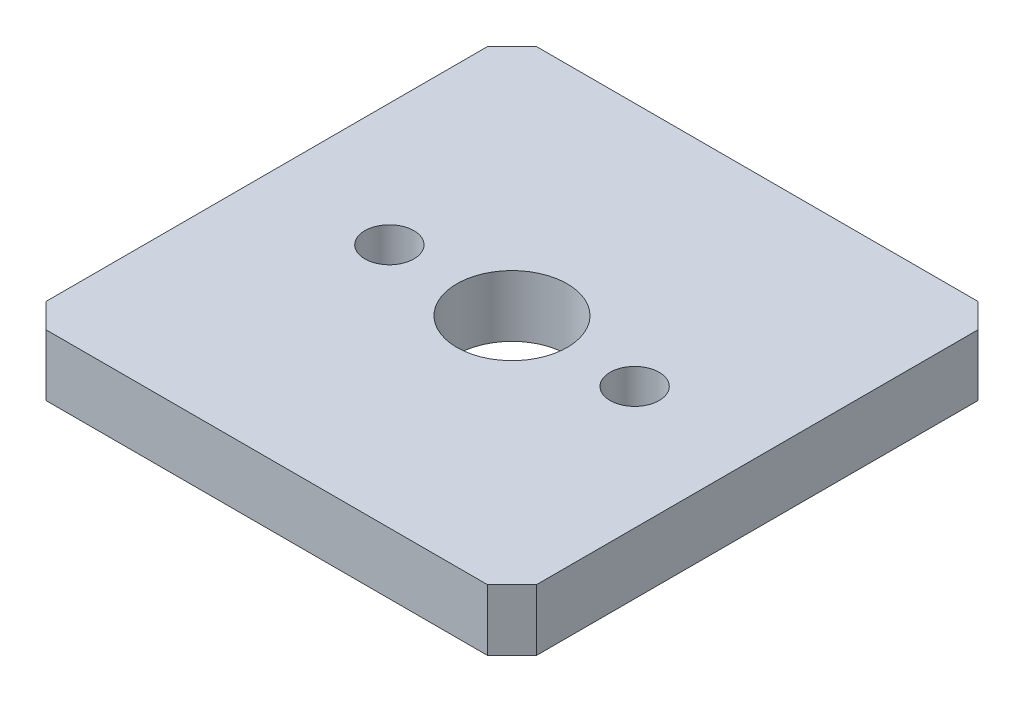
ISO-10303-21;
HEADER;
FILE_DESCRIPTION(('STEP AP214'),'2;1');
FILE_NAME('part.step','',(''),(''),'','','');
FILE_SCHEMA(('AUTOMOTIVE_DESIGN { 1 0 10303 214 1 1 1 1 }'));
ENDSEC;
DATA;
#1=APPLICATION_CONTEXT('core data for automotive mechanical design processes');
#2=APPLICATION_PROTOCOL_DEFINITION('international standard','automotive_design',2000,#1);
#3=PRODUCT_CONTEXT('',#1,'mechanical');
#4=PRODUCT('Part','Part','',(#3));
#5=PRODUCT_RELATED_PRODUCT_CATEGORY('part','',(#4));
#6=PRODUCT_DEFINITION_FORMATION('','',#4);
#7=PRODUCT_DEFINITION_CONTEXT('part definition',#1,'design');
#8=PRODUCT_DEFINITION('design','',#6,#7);
#9=PRODUCT_DEFINITION_SHAPE('','',#8);
#10=(LENGTH_UNIT() NAMED_UNIT(*) SI_UNIT(.MILLI.,.METRE.));
#11=(NAMED_UNIT(*) PLANE_ANGLE_UNIT() SI_UNIT($,.RADIAN.));
#12=(NAMED_UNIT(*) SI_UNIT($,.STERADIAN.) SOLID_ANGLE_UNIT());
#13=UNCERTAINTY_MEASURE_WITH_UNIT(LENGTH_MEASURE(1.E-05),#10,'distance_accuracy_value','');
#14=(GEOMETRIC_REPRESENTATION_CONTEXT(3) GLOBAL_UNCERTAINTY_ASSIGNED_CONTEXT((#13)) GLOBAL_UNIT_ASSIGNED_CONTEXT((#10,
#11,#12)) REPRESENTATION_CONTEXT('',''));
#15=CARTESIAN_POINT('',(0.,0.,0.));
#16=DIRECTION('',(0.,0.,1.));
#17=DIRECTION('',(1.,0.,0.));
#18=AXIS2_PLACEMENT_3D('',#15,#16,#17);
#19=CARTESIAN_POINT('',(0.,5.,0.));
#20=DIRECTION('',(0.,-1.,0.));
#21=DIRECTION('',(0.,0.,-1.));
#22=AXIS2_PLACEMENT_3D('',#19,#20,#21);
#23=PLANE('',#22);
#24=DIRECTION('',(-1.,0.,0.));
#25=VECTOR('',#24,1.);
#26=CARTESIAN_POINT('',(-18.,5.,-20.));
#27=LINE('',#26,#25);
#28=CARTESIAN_POINT('',(18.,5.,-20.));
#29=VERTEX_POINT('',#28);
#30=CARTESIAN_POINT('',(-18.,5.,-20.));
#31=VERTEX_POINT('',#30);
#32=EDGE_CURVE('E148',#29,#31,#27,.T.);
#33=ORIENTED_EDGE('',*,*,#32,.T.);
#34=DIRECTION('',(-0.707106781186547,0.,0.707106781186547));
#35=VECTOR('',#34,1.);
#36=CARTESIAN_POINT('',(-20.,5.,-18.));
#37=LINE('',#36,#35);
#38=CARTESIAN_POINT('',(-20.,5.,-18.));
#39=VERTEX_POINT('',#38);
#40=EDGE_CURVE('E96',#31,#39,#37,.T.);
#41=ORIENTED_EDGE('',*,*,#40,.T.);
#42=DIRECTION('',(0.,0.,1.));
#43=VECTOR('',#42,1.);
#44=CARTESIAN_POINT('',(-20.,5.,-18.));
#45=LINE('',#44,#43);
#46=CARTESIAN_POINT('',(-20.,5.,18.));
#47=VERTEX_POINT('',#46);
#48=EDGE_CURVE('E163',#39,#47,#45,.T.);
#49=ORIENTED_EDGE('',*,*,#48,.T.);
#50=DIRECTION('',(0.707106781186547,0.,0.707106781186547));
#51=VECTOR('',#50,1.);
#52=CARTESIAN_POINT('',(-20.,5.,18.));
#53=LINE('',#52,#51);
#54=CARTESIAN_POINT('',(-18.,5.,20.));
#55=VERTEX_POINT('',#54);
#56=EDGE_CURVE('E176',#47,#55,#53,.T.);
#57=ORIENTED_EDGE('',*,*,#56,.T.);
#58=DIRECTION('',(1.,0.,0.));
#59=VECTOR('',#58,1.);
#60=CARTESIAN_POINT('',(-18.,5.,20.));
#61=LINE('',#60,#59);
#62=CARTESIAN_POINT('',(18.,5.,20.));
#63=VERTEX_POINT('',#62);
#64=EDGE_CURVE('E115',#55,#63,#61,.T.);
#65=ORIENTED_EDGE('',*,*,#64,.T.);
#66=DIRECTION('',(0.707106781186547,0.,-0.707106781186548));
#67=VECTOR('',#66,1.);
#68=CARTESIAN_POINT('',(18.,5.,20.));
#69=LINE('',#68,#67);
#70=CARTESIAN_POINT('',(20.,5.,18.));
#71=VERTEX_POINT('',#70);
#72=EDGE_CURVE('E109',#63,#71,#69,.T.);
#73=ORIENTED_EDGE('',*,*,#72,.T.);
#74=DIRECTION('',(0.,0.,-1.));
#75=VECTOR('',#74,1.);
#76=CARTESIAN_POINT('',(20.,5.,-18.));
#77=LINE('',#76,#75);
#78=CARTESIAN_POINT('',(20.,5.,-18.));
#79=VERTEX_POINT('',#78);
#80=EDGE_CURVE('E113',#71,#79,#77,.T.);
#81=ORIENTED_EDGE('',*,*,#80,.T.);
#82=DIRECTION('',(-0.707106781186547,0.,-0.707106781186547));
#83=VECTOR('',#82,1.);
#84=CARTESIAN_POINT('',(18.,5.,-20.));
#85=LINE('',#84,#83);
#86=EDGE_CURVE('E53',#79,#29,#85,.T.);
#87=ORIENTED_EDGE('',*,*,#86,.T.);
#88=EDGE_LOOP('',(#33,#41,#49,#57,#65,#73,#81,#87));
#89=FACE_BOUND('',#88,.T.);
#90=CARTESIAN_POINT('',(0.,5.,0.));
#91=DIRECTION('',(0.,1.,0.));
#92=DIRECTION('',(0.,0.,1.));
#93=AXIS2_PLACEMENT_3D('',#90,#91,#92);
#94=CIRCLE('',#93,4.5);
#95=CARTESIAN_POINT('',(0.,5.,4.5));
#96=VERTEX_POINT('',#95);
#97=EDGE_CURVE('E137',#96,#96,#94,.T.);
#98=ORIENTED_EDGE('',*,*,#97,.F.);
#99=EDGE_LOOP('',(#98));
#100=FACE_BOUND('',#99,.T.);
#101=CARTESIAN_POINT('',(10.,5.,0.));
#102=DIRECTION('',(0.,1.,0.));
#103=DIRECTION('',(0.,0.,1.));
#104=AXIS2_PLACEMENT_3D('',#101,#102,#103);
#105=CIRCLE('',#104,2.);
#106=CARTESIAN_POINT('',(10.,5.,2.));
#107=VERTEX_POINT('',#106);
#108=EDGE_CURVE('E185',#107,#107,#105,.T.);
#109=ORIENTED_EDGE('',*,*,#108,.F.);
#110=EDGE_LOOP('',(#109));
#111=FACE_BOUND('',#110,.T.);
#112=CARTESIAN_POINT('',(-10.,5.,0.));
#113=DIRECTION('',(0.,1.,0.));
#114=DIRECTION('',(0.,0.,1.));
#115=AXIS2_PLACEMENT_3D('',#112,#113,#114);
#116=CIRCLE('',#115,2.);
#117=CARTESIAN_POINT('',(-10.,5.,2.));
#118=VERTEX_POINT('',#117);
#119=EDGE_CURVE('E191',#118,#118,#116,.T.);
#120=ORIENTED_EDGE('',*,*,#119,.F.);
#121=EDGE_LOOP('',(#120));
#122=FACE_BOUND('',#121,.T.);
#123=ADVANCED_FACE('F36',(#89,#100,#111,#122),#23,.F.);
#124=CARTESIAN_POINT('',(0.,0.,0.));
#125=DIRECTION('',(0.,-1.,0.));
#126=DIRECTION('',(0.,0.,-1.));
#127=AXIS2_PLACEMENT_3D('',#124,#125,#126);
#128=PLANE('',#127);
#129=CARTESIAN_POINT('',(10.,0.,0.));
#130=DIRECTION('',(0.,1.,0.));
#131=DIRECTION('',(0.,0.,1.));
#132=AXIS2_PLACEMENT_3D('',#129,#130,#131);
#133=CIRCLE('',#132,2.);
#134=CARTESIAN_POINT('',(10.,0.,2.));
#135=VERTEX_POINT('',#134);
#136=EDGE_CURVE('E188',#135,#135,#133,.T.);
#137=ORIENTED_EDGE('',*,*,#136,.T.);
#138=EDGE_LOOP('',(#137));
#139=FACE_BOUND('',#138,.T.);
#140=DIRECTION('',(-1.,0.,0.));
#141=VECTOR('',#140,1.);
#142=CARTESIAN_POINT('',(-18.,0.,-20.));
#143=LINE('',#142,#141);
#144=CARTESIAN_POINT('',(18.,0.,-20.));
#145=VERTEX_POINT('',#144);
#146=CARTESIAN_POINT('',(-18.,0.,-20.));
#147=VERTEX_POINT('',#146);
#148=EDGE_CURVE('E133',#145,#147,#143,.T.);
#149=ORIENTED_EDGE('',*,*,#148,.F.);
#150=DIRECTION('',(-0.707106781186547,0.,-0.707106781186547));
#151=VECTOR('',#150,1.);
#152=CARTESIAN_POINT('',(18.,0.,-20.));
#153=LINE('',#152,#151);
#154=CARTESIAN_POINT('',(20.,0.,-18.));
#155=VERTEX_POINT('',#154);
#156=EDGE_CURVE('E88',#155,#145,#153,.T.);
#157=ORIENTED_EDGE('',*,*,#156,.F.);
#158=DIRECTION('',(0.,0.,-1.));
#159=VECTOR('',#158,1.);
#160=CARTESIAN_POINT('',(20.,0.,-18.));
#161=LINE('',#160,#159);
#162=CARTESIAN_POINT('',(20.,0.,18.));
#163=VERTEX_POINT('',#162);
#164=EDGE_CURVE('E82',#163,#155,#161,.T.);
#165=ORIENTED_EDGE('',*,*,#164,.F.);
#166=DIRECTION('',(0.707106781186547,0.,-0.707106781186548));
#167=VECTOR('',#166,1.);
#168=CARTESIAN_POINT('',(18.,0.,20.));
#169=LINE('',#168,#167);
#170=CARTESIAN_POINT('',(18.,0.,20.));
#171=VERTEX_POINT('',#170);
#172=EDGE_CURVE('E123',#171,#163,#169,.T.);
#173=ORIENTED_EDGE('',*,*,#172,.F.);
#174=DIRECTION('',(1.,0.,0.));
#175=VECTOR('',#174,1.);
#176=CARTESIAN_POINT('',(-18.,0.,20.));
#177=LINE('',#176,#175);
#178=CARTESIAN_POINT('',(-18.,0.,20.));
#179=VERTEX_POINT('',#178);
#180=EDGE_CURVE('E143',#179,#171,#177,.T.);
#181=ORIENTED_EDGE('',*,*,#180,.F.);
#182=DIRECTION('',(0.707106781186547,0.,0.707106781186547));
#183=VECTOR('',#182,1.);
#184=CARTESIAN_POINT('',(-20.,0.,18.));
#185=LINE('',#184,#183);
#186=CARTESIAN_POINT('',(-20.,0.,18.));
#187=VERTEX_POINT('',#186);
#188=EDGE_CURVE('E141',#187,#179,#185,.T.);
#189=ORIENTED_EDGE('',*,*,#188,.F.);
#190=DIRECTION('',(0.,0.,1.));
#191=VECTOR('',#190,1.);
#192=CARTESIAN_POINT('',(-20.,0.,-18.));
#193=LINE('',#192,#191);
#194=CARTESIAN_POINT('',(-20.,0.,-18.));
#195=VERTEX_POINT('',#194);
#196=EDGE_CURVE('E139',#195,#187,#193,.T.);
#197=ORIENTED_EDGE('',*,*,#196,.F.);
#198=DIRECTION('',(-0.707106781186547,0.,0.707106781186547));
#199=VECTOR('',#198,1.);
#200=CARTESIAN_POINT('',(-20.,0.,-18.));
#201=LINE('',#200,#199);
#202=EDGE_CURVE('E136',#147,#195,#201,.T.);
#203=ORIENTED_EDGE('',*,*,#202,.F.);
#204=EDGE_LOOP('',(#149,#157,#165,#173,#181,#189,#197,#203));
#205=FACE_BOUND('',#204,.T.);
#206=CARTESIAN_POINT('',(0.,0.,0.));
#207=DIRECTION('',(0.,1.,0.));
#208=DIRECTION('',(0.,0.,1.));
#209=AXIS2_PLACEMENT_3D('',#206,#207,#208);
#210=CIRCLE('',#209,4.5);
#211=CARTESIAN_POINT('',(0.,0.,4.5));
#212=VERTEX_POINT('',#211);
#213=EDGE_CURVE('E182',#212,#212,#210,.T.);
#214=ORIENTED_EDGE('',*,*,#213,.T.);
#215=EDGE_LOOP('',(#214));
#216=FACE_BOUND('',#215,.T.);
#217=CARTESIAN_POINT('',(-10.,0.,0.));
#218=DIRECTION('',(0.,1.,0.));
#219=DIRECTION('',(0.,0.,1.));
#220=AXIS2_PLACEMENT_3D('',#217,#218,#219);
#221=CIRCLE('',#220,2.);
#222=CARTESIAN_POINT('',(-10.,0.,2.));
#223=VERTEX_POINT('',#222);
#224=EDGE_CURVE('E194',#223,#223,#221,.T.);
#225=ORIENTED_EDGE('',*,*,#224,.T.);
#226=EDGE_LOOP('',(#225));
#227=FACE_BOUND('',#226,.T.);
#228=ADVANCED_FACE('F167',(#139,#205,#216,#227),#128,.T.);
#229=CARTESIAN_POINT('',(-18.,5.,-20.));
#230=DIRECTION('',(0.,0.,1.));
#231=DIRECTION('',(1.,0.,0.));
#232=AXIS2_PLACEMENT_3D('',#229,#230,#231);
#233=PLANE('',#232);
#234=ORIENTED_EDGE('',*,*,#148,.T.);
#235=DIRECTION('',(0.,-1.,0.));
#236=VECTOR('',#235,1.);
#237=CARTESIAN_POINT('',(-18.,5.,-20.));
#238=LINE('',#237,#236);
#239=EDGE_CURVE('E11',#31,#147,#238,.T.);
#240=ORIENTED_EDGE('',*,*,#239,.F.);
#241=ORIENTED_EDGE('',*,*,#32,.F.);
#242=DIRECTION('',(0.,-1.,0.));
#243=VECTOR('',#242,1.);
#244=CARTESIAN_POINT('',(18.,5.,-20.));
#245=LINE('',#244,#243);
#246=EDGE_CURVE('E129',#29,#145,#245,.T.);
#247=ORIENTED_EDGE('',*,*,#246,.T.);
#248=EDGE_LOOP('',(#234,#240,#241,#247));
#249=FACE_BOUND('',#248,.T.);
#250=ADVANCED_FACE('F38',(#249),#233,.F.);
#251=CARTESIAN_POINT('',(-20.,5.,-18.));
#252=DIRECTION('',(0.707106781186548,0.,0.707106781186548));
#253=DIRECTION('',(0.707106781186548,0.,-0.707106781186548));
#254=AXIS2_PLACEMENT_3D('',#251,#252,#253);
#255=PLANE('',#254);
#256=ORIENTED_EDGE('',*,*,#202,.T.);
#257=DIRECTION('',(0.,-1.,0.));
#258=VECTOR('',#257,1.);
#259=CARTESIAN_POINT('',(-20.,5.,-18.));
#260=LINE('',#259,#258);
#261=EDGE_CURVE('E45',#39,#195,#260,.T.);
#262=ORIENTED_EDGE('',*,*,#261,.F.);
#263=ORIENTED_EDGE('',*,*,#40,.F.);
#264=ORIENTED_EDGE('',*,*,#239,.T.);
#265=EDGE_LOOP('',(#256,#262,#263,#264));
#266=FACE_BOUND('',#265,.T.);
#267=ADVANCED_FACE('F226',(#266),#255,.F.);
#268=CARTESIAN_POINT('',(-20.,5.,-18.));
#269=DIRECTION('',(1.,0.,0.));
#270=DIRECTION('',(0.,0.,-1.));
#271=AXIS2_PLACEMENT_3D('',#268,#269,#270);
#272=PLANE('',#271);
#273=ORIENTED_EDGE('',*,*,#196,.T.);
#274=DIRECTION('',(0.,-1.,0.));
#275=VECTOR('',#274,1.);
#276=CARTESIAN_POINT('',(-20.,5.,18.));
#277=LINE('',#276,#275);
#278=EDGE_CURVE('E155',#47,#187,#277,.T.);
#279=ORIENTED_EDGE('',*,*,#278,.F.);
#280=ORIENTED_EDGE('',*,*,#48,.F.);
#281=ORIENTED_EDGE('',*,*,#261,.T.);
#282=EDGE_LOOP('',(#273,#279,#280,#281));
#283=FACE_BOUND('',#282,.T.);
#284=ADVANCED_FACE('F161',(#283),#272,.F.);
#285=CARTESIAN_POINT('',(-20.,5.,18.));
#286=DIRECTION('',(0.707106781186548,0.,-0.707106781186548));
#287=DIRECTION('',(-0.707106781186548,0.,-0.707106781186548));
#288=AXIS2_PLACEMENT_3D('',#285,#286,#287);
#289=PLANE('',#288);
#290=ORIENTED_EDGE('',*,*,#188,.T.);
#291=DIRECTION('',(0.,-1.,0.));
#292=VECTOR('',#291,1.);
#293=CARTESIAN_POINT('',(-18.,5.,20.));
#294=LINE('',#293,#292);
#295=EDGE_CURVE('E152',#55,#179,#294,.T.);
#296=ORIENTED_EDGE('',*,*,#295,.F.);
#297=ORIENTED_EDGE('',*,*,#56,.F.);
#298=ORIENTED_EDGE('',*,*,#278,.T.);
#299=EDGE_LOOP('',(#290,#296,#297,#298));
#300=FACE_BOUND('',#299,.T.);
#301=ADVANCED_FACE('F172',(#300),#289,.F.);
#302=CARTESIAN_POINT('',(-18.,5.,20.));
#303=DIRECTION('',(0.,0.,-1.));
#304=DIRECTION('',(-1.,0.,0.));
#305=AXIS2_PLACEMENT_3D('',#302,#303,#304);
#306=PLANE('',#305);
#307=ORIENTED_EDGE('',*,*,#180,.T.);
#308=DIRECTION('',(0.,-1.,0.));
#309=VECTOR('',#308,1.);
#310=CARTESIAN_POINT('',(18.,5.,20.));
#311=LINE('',#310,#309);
#312=EDGE_CURVE('E124',#63,#171,#311,.T.);
#313=ORIENTED_EDGE('',*,*,#312,.F.);
#314=ORIENTED_EDGE('',*,*,#64,.F.);
#315=ORIENTED_EDGE('',*,*,#295,.T.);
#316=EDGE_LOOP('',(#307,#313,#314,#315));
#317=FACE_BOUND('',#316,.T.);
#318=ADVANCED_FACE('F175',(#317),#306,.F.);
#319=CARTESIAN_POINT('',(18.,5.,20.));
#320=DIRECTION('',(-0.707106781186548,0.,-0.707106781186547));
#321=DIRECTION('',(-0.707106781186547,0.,0.707106781186548));
#322=AXIS2_PLACEMENT_3D('',#319,#320,#321);
#323=PLANE('',#322);
#324=ORIENTED_EDGE('',*,*,#172,.T.);
#325=DIRECTION('',(0.,-1.,0.));
#326=VECTOR('',#325,1.);
#327=CARTESIAN_POINT('',(20.,5.,18.));
#328=LINE('',#327,#326);
#329=EDGE_CURVE('E120',#71,#163,#328,.T.);
#330=ORIENTED_EDGE('',*,*,#329,.F.);
#331=ORIENTED_EDGE('',*,*,#72,.F.);
#332=ORIENTED_EDGE('',*,*,#312,.T.);
#333=EDGE_LOOP('',(#324,#330,#331,#332));
#334=FACE_BOUND('',#333,.T.);
#335=ADVANCED_FACE('F121',(#334),#323,.F.);
#336=CARTESIAN_POINT('',(20.,5.,-18.));
#337=DIRECTION('',(-1.,0.,0.));
#338=DIRECTION('',(0.,0.,1.));
#339=AXIS2_PLACEMENT_3D('',#336,#337,#338);
#340=PLANE('',#339);
#341=ORIENTED_EDGE('',*,*,#164,.T.);
#342=DIRECTION('',(0.,-1.,0.));
#343=VECTOR('',#342,1.);
#344=CARTESIAN_POINT('',(20.,5.,-18.));
#345=LINE('',#344,#343);
#346=EDGE_CURVE('E125',#79,#155,#345,.T.);
#347=ORIENTED_EDGE('',*,*,#346,.F.);
#348=ORIENTED_EDGE('',*,*,#80,.F.);
#349=ORIENTED_EDGE('',*,*,#329,.T.);
#350=EDGE_LOOP('',(#341,#347,#348,#349));
#351=FACE_BOUND('',#350,.T.);
#352=ADVANCED_FACE('F127',(#351),#340,.F.);
#353=CARTESIAN_POINT('',(18.,5.,-20.));
#354=DIRECTION('',(-0.707106781186548,0.,0.707106781186548));
#355=DIRECTION('',(0.707106781186548,0.,0.707106781186548));
#356=AXIS2_PLACEMENT_3D('',#353,#354,#355);
#357=PLANE('',#356);
#358=ORIENTED_EDGE('',*,*,#156,.T.);
#359=ORIENTED_EDGE('',*,*,#246,.F.);
#360=ORIENTED_EDGE('',*,*,#86,.F.);
#361=ORIENTED_EDGE('',*,*,#346,.T.);
#362=EDGE_LOOP('',(#358,#359,#360,#361));
#363=FACE_BOUND('',#362,.T.);
#364=ADVANCED_FACE('F214',(#363),#357,.F.);
#365=CARTESIAN_POINT('',(0.,5.,0.));
#366=DIRECTION('',(0.,-1.,0.));
#367=DIRECTION('',(0.,0.,-1.));
#368=AXIS2_PLACEMENT_3D('',#365,#366,#367);
#369=CYLINDRICAL_SURFACE('',#368,4.5);
#370=ORIENTED_EDGE('',*,*,#97,.T.);
#371=EDGE_LOOP('',(#370));
#372=FACE_BOUND('',#371,.T.);
#373=ORIENTED_EDGE('',*,*,#213,.F.);
#374=EDGE_LOOP('',(#373));
#375=FACE_BOUND('',#374,.T.);
#376=ADVANCED_FACE('F211',(#372,#375),#369,.F.);
#377=CARTESIAN_POINT('',(10.,5.,0.));
#378=DIRECTION('',(0.,-1.,0.));
#379=DIRECTION('',(0.,0.,-1.));
#380=AXIS2_PLACEMENT_3D('',#377,#378,#379);
#381=CYLINDRICAL_SURFACE('',#380,2.);
#382=ORIENTED_EDGE('',*,*,#108,.T.);
#383=EDGE_LOOP('',(#382));
#384=FACE_BOUND('',#383,.T.);
#385=ORIENTED_EDGE('',*,*,#136,.F.);
#386=EDGE_LOOP('',(#385));
#387=FACE_BOUND('',#386,.T.);
#388=ADVANCED_FACE('F290',(#384,#387),#381,.F.);
#389=CARTESIAN_POINT('',(-10.,5.,0.));
#390=DIRECTION('',(0.,-1.,0.));
#391=DIRECTION('',(0.,0.,-1.));
#392=AXIS2_PLACEMENT_3D('',#389,#390,#391);
#393=CYLINDRICAL_SURFACE('',#392,2.);
#394=ORIENTED_EDGE('',*,*,#119,.T.);
#395=EDGE_LOOP('',(#394));
#396=FACE_BOUND('',#395,.T.);
#397=ORIENTED_EDGE('',*,*,#224,.F.);
#398=EDGE_LOOP('',(#397));
#399=FACE_BOUND('',#398,.T.);
#400=ADVANCED_FACE('F200',(#396,#399),#393,.F.);
#401=CLOSED_SHELL('',(#123,#228,#250,#267,#284,#301,#318,#335,#352,#364,#376,#388,#400));
#402=MANIFOLD_SOLID_BREP('B2',#401);
#403=ADVANCED_BREP_SHAPE_REPRESENTATION('',(#18,#402),#14);
#404=SHAPE_DEFINITION_REPRESENTATION(#9,#403);
ENDSEC;
END-ISO-10303-21;
